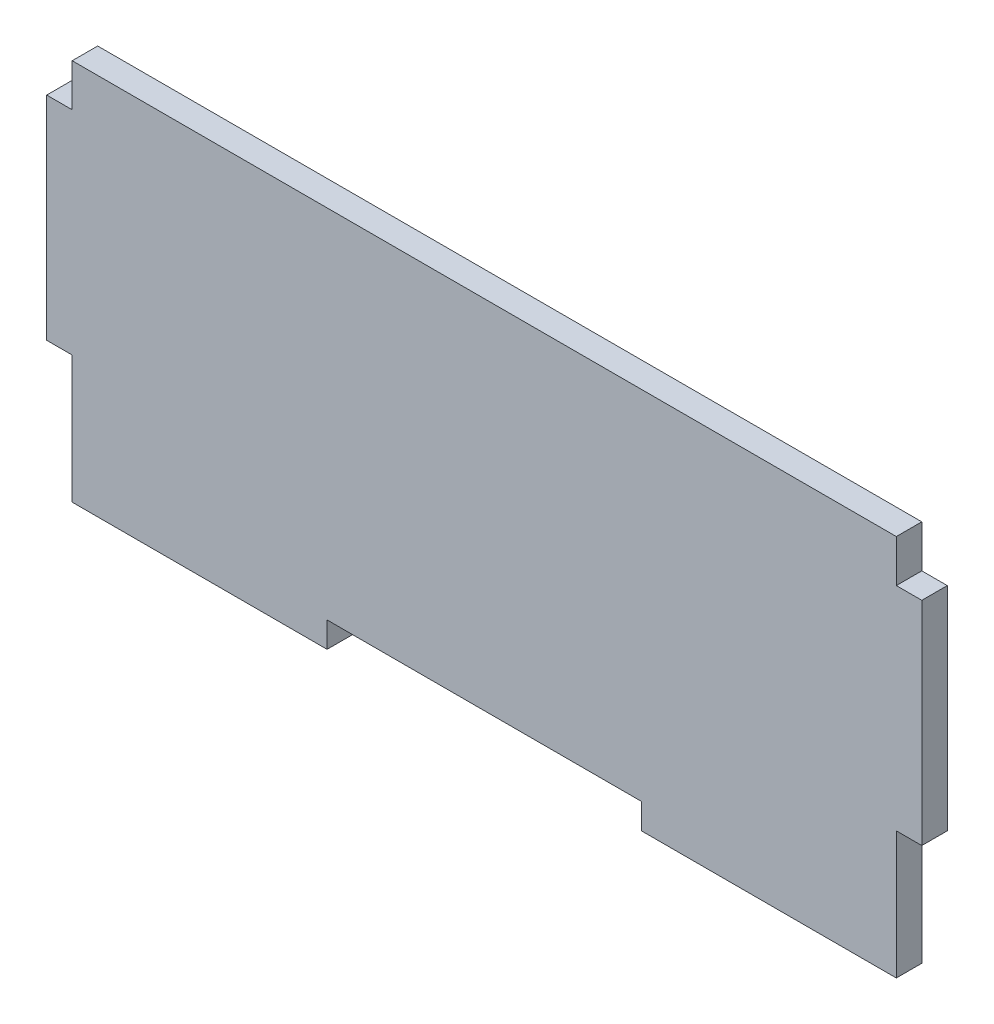
ISO-10303-21;
HEADER;
FILE_DESCRIPTION(('STEP AP214'),'2;1');
FILE_NAME('part.step','',(''),(''),'','','');
FILE_SCHEMA(('AUTOMOTIVE_DESIGN { 1 0 10303 214 1 1 1 1 }'));
ENDSEC;
DATA;
#1=APPLICATION_CONTEXT('core data for automotive mechanical design processes');
#2=APPLICATION_PROTOCOL_DEFINITION('international standard','automotive_design',2000,#1);
#3=PRODUCT_CONTEXT('',#1,'mechanical');
#4=PRODUCT('Part','Part','',(#3));
#5=PRODUCT_RELATED_PRODUCT_CATEGORY('part','',(#4));
#6=PRODUCT_DEFINITION_FORMATION('','',#4);
#7=PRODUCT_DEFINITION_CONTEXT('part definition',#1,'design');
#8=PRODUCT_DEFINITION('design','',#6,#7);
#9=PRODUCT_DEFINITION_SHAPE('','',#8);
#10=(LENGTH_UNIT() NAMED_UNIT(*) SI_UNIT(.MILLI.,.METRE.));
#11=(NAMED_UNIT(*) PLANE_ANGLE_UNIT() SI_UNIT($,.RADIAN.));
#12=(NAMED_UNIT(*) SI_UNIT($,.STERADIAN.) SOLID_ANGLE_UNIT());
#13=UNCERTAINTY_MEASURE_WITH_UNIT(LENGTH_MEASURE(1.E-05),#10,'distance_accuracy_value','');
#14=(GEOMETRIC_REPRESENTATION_CONTEXT(3) GLOBAL_UNCERTAINTY_ASSIGNED_CONTEXT((#13)) GLOBAL_UNIT_ASSIGNED_CONTEXT((#10,
#11,#12)) REPRESENTATION_CONTEXT('',''));
#15=CARTESIAN_POINT('',(0.,0.,0.));
#16=DIRECTION('',(0.,0.,1.));
#17=DIRECTION('',(1.,0.,0.));
#18=AXIS2_PLACEMENT_3D('',#15,#16,#17);
#19=CARTESIAN_POINT('',(-51.5,-27.5,3.));
#20=DIRECTION('',(0.,1.,0.));
#21=DIRECTION('',(0.,0.,1.));
#22=AXIS2_PLACEMENT_3D('',#19,#20,#21);
#23=PLANE('',#22);
#24=DIRECTION('',(0.,0.,-1.));
#25=VECTOR('',#24,1.);
#26=CARTESIAN_POINT('',(-18.5,-27.5,3.));
#27=LINE('',#26,#25);
#28=CARTESIAN_POINT('',(-18.5,-27.5,3.));
#29=VERTEX_POINT('',#28);
#30=CARTESIAN_POINT('',(-18.5,-27.5,0.));
#31=VERTEX_POINT('',#30);
#32=EDGE_CURVE('E276',#29,#31,#27,.T.);
#33=ORIENTED_EDGE('',*,*,#32,.F.);
#34=DIRECTION('',(1.,0.,0.));
#35=VECTOR('',#34,1.);
#36=CARTESIAN_POINT('',(-51.5,-27.5,3.));
#37=LINE('',#36,#35);
#38=CARTESIAN_POINT('',(-48.5,-27.5,3.));
#39=VERTEX_POINT('',#38);
#40=EDGE_CURVE('E46',#39,#29,#37,.T.);
#41=ORIENTED_EDGE('',*,*,#40,.F.);
#42=DIRECTION('',(0.,0.,-1.));
#43=VECTOR('',#42,1.);
#44=CARTESIAN_POINT('',(-48.5,-27.5,3.));
#45=LINE('',#44,#43);
#46=CARTESIAN_POINT('',(-48.5,-27.5,0.));
#47=VERTEX_POINT('',#46);
#48=EDGE_CURVE('E266',#39,#47,#45,.T.);
#49=ORIENTED_EDGE('',*,*,#48,.T.);
#50=DIRECTION('',(1.,0.,0.));
#51=VECTOR('',#50,1.);
#52=CARTESIAN_POINT('',(-51.5,-27.5,0.));
#53=LINE('',#52,#51);
#54=EDGE_CURVE('E188',#47,#31,#53,.T.);
#55=ORIENTED_EDGE('',*,*,#54,.T.);
#56=EDGE_LOOP('',(#33,#41,#49,#55));
#57=FACE_BOUND('',#56,.T.);
#58=ADVANCED_FACE('F38',(#57),#23,.F.);
#59=CARTESIAN_POINT('',(0.,0.,3.));
#60=DIRECTION('',(0.,0.,-1.));
#61=DIRECTION('',(-1.,0.,0.));
#62=AXIS2_PLACEMENT_3D('',#59,#60,#61);
#63=PLANE('',#62);
#64=DIRECTION('',(0.,-1.,0.));
#65=VECTOR('',#64,1.);
#66=CARTESIAN_POINT('',(48.5,0.,3.));
#67=LINE('',#66,#65);
#68=CARTESIAN_POINT('',(48.5,17.5,3.));
#69=VERTEX_POINT('',#68);
#70=CARTESIAN_POINT('',(48.5,12.5,3.));
#71=VERTEX_POINT('',#70);
#72=EDGE_CURVE('E174',#69,#71,#67,.T.);
#73=ORIENTED_EDGE('',*,*,#72,.F.);
#74=DIRECTION('',(-1.,0.,0.));
#75=VECTOR('',#74,1.);
#76=CARTESIAN_POINT('',(0.,17.5,3.));
#77=LINE('',#76,#75);
#78=CARTESIAN_POINT('',(-48.5,17.5,3.));
#79=VERTEX_POINT('',#78);
#80=EDGE_CURVE('E152',#69,#79,#77,.T.);
#81=ORIENTED_EDGE('',*,*,#80,.T.);
#82=DIRECTION('',(0.,-1.,0.));
#83=VECTOR('',#82,1.);
#84=CARTESIAN_POINT('',(-48.5,0.,3.));
#85=LINE('',#84,#83);
#86=CARTESIAN_POINT('',(-48.5,12.5,3.));
#87=VERTEX_POINT('',#86);
#88=EDGE_CURVE('E238',#79,#87,#85,.T.);
#89=ORIENTED_EDGE('',*,*,#88,.T.);
#90=DIRECTION('',(-1.,0.,0.));
#91=VECTOR('',#90,1.);
#92=CARTESIAN_POINT('',(0.,12.5,3.));
#93=LINE('',#92,#91);
#94=CARTESIAN_POINT('',(-51.5,12.5,3.));
#95=VERTEX_POINT('',#94);
#96=EDGE_CURVE('E240',#87,#95,#93,.T.);
#97=ORIENTED_EDGE('',*,*,#96,.T.);
#98=DIRECTION('',(0.,-1.,0.));
#99=VECTOR('',#98,1.);
#100=CARTESIAN_POINT('',(-51.5,-27.5,3.));
#101=LINE('',#100,#99);
#102=CARTESIAN_POINT('',(-51.5,-12.5,3.));
#103=VERTEX_POINT('',#102);
#104=EDGE_CURVE('E187',#95,#103,#101,.T.);
#105=ORIENTED_EDGE('',*,*,#104,.T.);
#106=DIRECTION('',(-1.,0.,0.));
#107=VECTOR('',#106,1.);
#108=CARTESIAN_POINT('',(0.,-12.5,3.));
#109=LINE('',#108,#107);
#110=CARTESIAN_POINT('',(-48.5,-12.5,3.));
#111=VERTEX_POINT('',#110);
#112=EDGE_CURVE('E272',#111,#103,#109,.T.);
#113=ORIENTED_EDGE('',*,*,#112,.F.);
#114=DIRECTION('',(0.,-1.,0.));
#115=VECTOR('',#114,1.);
#116=CARTESIAN_POINT('',(-48.5,0.,3.));
#117=LINE('',#116,#115);
#118=EDGE_CURVE('E267',#111,#39,#117,.T.);
#119=ORIENTED_EDGE('',*,*,#118,.T.);
#120=ORIENTED_EDGE('',*,*,#40,.T.);
#121=DIRECTION('',(0.,-1.,0.));
#122=VECTOR('',#121,1.);
#123=CARTESIAN_POINT('',(-18.5,0.,3.));
#124=LINE('',#123,#122);
#125=CARTESIAN_POINT('',(-18.5,-24.5,3.));
#126=VERTEX_POINT('',#125);
#127=EDGE_CURVE('E289',#126,#29,#124,.T.);
#128=ORIENTED_EDGE('',*,*,#127,.F.);
#129=DIRECTION('',(-1.,0.,0.));
#130=VECTOR('',#129,1.);
#131=CARTESIAN_POINT('',(0.,-24.5,3.));
#132=LINE('',#131,#130);
#133=CARTESIAN_POINT('',(18.5,-24.5,3.));
#134=VERTEX_POINT('',#133);
#135=EDGE_CURVE('E295',#134,#126,#132,.T.);
#136=ORIENTED_EDGE('',*,*,#135,.F.);
#137=DIRECTION('',(0.,-1.,0.));
#138=VECTOR('',#137,1.);
#139=CARTESIAN_POINT('',(18.5,0.,3.));
#140=LINE('',#139,#138);
#141=CARTESIAN_POINT('',(18.5,-27.5,3.));
#142=VERTEX_POINT('',#141);
#143=EDGE_CURVE('E283',#134,#142,#140,.T.);
#144=ORIENTED_EDGE('',*,*,#143,.T.);
#145=CARTESIAN_POINT('',(48.5,-27.5,3.));
#146=VERTEX_POINT('',#145);
#147=EDGE_CURVE('E191',#142,#146,#37,.T.);
#148=ORIENTED_EDGE('',*,*,#147,.T.);
#149=DIRECTION('',(0.,-1.,0.));
#150=VECTOR('',#149,1.);
#151=CARTESIAN_POINT('',(48.5,0.,3.));
#152=LINE('',#151,#150);
#153=CARTESIAN_POINT('',(48.5,-12.5,3.));
#154=VERTEX_POINT('',#153);
#155=EDGE_CURVE('E222',#154,#146,#152,.T.);
#156=ORIENTED_EDGE('',*,*,#155,.F.);
#157=DIRECTION('',(-1.,0.,0.));
#158=VECTOR('',#157,1.);
#159=CARTESIAN_POINT('',(0.,-12.5,3.));
#160=LINE('',#159,#158);
#161=CARTESIAN_POINT('',(51.5,-12.5,3.));
#162=VERTEX_POINT('',#161);
#163=EDGE_CURVE('E228',#162,#154,#160,.T.);
#164=ORIENTED_EDGE('',*,*,#163,.F.);
#165=DIRECTION('',(0.,1.,0.));
#166=VECTOR('',#165,1.);
#167=CARTESIAN_POINT('',(51.5,-27.5,3.));
#168=LINE('',#167,#166);
#169=CARTESIAN_POINT('',(51.5,12.5,3.));
#170=VERTEX_POINT('',#169);
#171=EDGE_CURVE('E184',#162,#170,#168,.T.);
#172=ORIENTED_EDGE('',*,*,#171,.T.);
#173=DIRECTION('',(-1.,0.,0.));
#174=VECTOR('',#173,1.);
#175=CARTESIAN_POINT('',(0.,12.5,3.));
#176=LINE('',#175,#174);
#177=EDGE_CURVE('E170',#170,#71,#176,.T.);
#178=ORIENTED_EDGE('',*,*,#177,.T.);
#179=EDGE_LOOP('',(#73,#81,#89,#97,#105,#113,#119,#120,#128,#136,#144,#148,#156,#164,#172,#178));
#180=FACE_BOUND('',#179,.T.);
#181=ADVANCED_FACE('F255',(#180),#63,.F.);
#182=CARTESIAN_POINT('',(0.,0.,0.));
#183=DIRECTION('',(0.,0.,-1.));
#184=DIRECTION('',(-1.,0.,0.));
#185=AXIS2_PLACEMENT_3D('',#182,#183,#184);
#186=PLANE('',#185);
#187=DIRECTION('',(-1.,0.,0.));
#188=VECTOR('',#187,1.);
#189=CARTESIAN_POINT('',(48.5,17.5,0.));
#190=LINE('',#189,#188);
#191=CARTESIAN_POINT('',(48.5,17.5,0.));
#192=VERTEX_POINT('',#191);
#193=CARTESIAN_POINT('',(-48.5,17.5,0.));
#194=VERTEX_POINT('',#193);
#195=EDGE_CURVE('E53',#192,#194,#190,.T.);
#196=ORIENTED_EDGE('',*,*,#195,.F.);
#197=DIRECTION('',(0.,-1.,0.));
#198=VECTOR('',#197,1.);
#199=CARTESIAN_POINT('',(48.5,0.,0.));
#200=LINE('',#199,#198);
#201=CARTESIAN_POINT('',(48.5,12.5,0.));
#202=VERTEX_POINT('',#201);
#203=EDGE_CURVE('E161',#192,#202,#200,.T.);
#204=ORIENTED_EDGE('',*,*,#203,.T.);
#205=DIRECTION('',(-1.,0.,0.));
#206=VECTOR('',#205,1.);
#207=CARTESIAN_POINT('',(0.,12.5,0.));
#208=LINE('',#207,#206);
#209=CARTESIAN_POINT('',(51.5,12.5,0.));
#210=VERTEX_POINT('',#209);
#211=EDGE_CURVE('E171',#210,#202,#208,.T.);
#212=ORIENTED_EDGE('',*,*,#211,.F.);
#213=DIRECTION('',(0.,1.,0.));
#214=VECTOR('',#213,1.);
#215=CARTESIAN_POINT('',(51.5,-27.5,0.));
#216=LINE('',#215,#214);
#217=CARTESIAN_POINT('',(51.5,-12.5,0.));
#218=VERTEX_POINT('',#217);
#219=EDGE_CURVE('E181',#218,#210,#216,.T.);
#220=ORIENTED_EDGE('',*,*,#219,.F.);
#221=DIRECTION('',(-1.,0.,0.));
#222=VECTOR('',#221,1.);
#223=CARTESIAN_POINT('',(0.,-12.5,0.));
#224=LINE('',#223,#222);
#225=CARTESIAN_POINT('',(48.5,-12.5,0.));
#226=VERTEX_POINT('',#225);
#227=EDGE_CURVE('E227',#218,#226,#224,.T.);
#228=ORIENTED_EDGE('',*,*,#227,.T.);
#229=DIRECTION('',(0.,-1.,0.));
#230=VECTOR('',#229,1.);
#231=CARTESIAN_POINT('',(48.5,0.,0.));
#232=LINE('',#231,#230);
#233=CARTESIAN_POINT('',(48.5,-27.5,0.));
#234=VERTEX_POINT('',#233);
#235=EDGE_CURVE('E219',#226,#234,#232,.T.);
#236=ORIENTED_EDGE('',*,*,#235,.T.);
#237=CARTESIAN_POINT('',(18.5,-27.5,0.));
#238=VERTEX_POINT('',#237);
#239=EDGE_CURVE('E198',#238,#234,#53,.T.);
#240=ORIENTED_EDGE('',*,*,#239,.F.);
#241=DIRECTION('',(0.,-1.,0.));
#242=VECTOR('',#241,1.);
#243=CARTESIAN_POINT('',(18.5,0.,0.));
#244=LINE('',#243,#242);
#245=CARTESIAN_POINT('',(18.5,-24.5,0.));
#246=VERTEX_POINT('',#245);
#247=EDGE_CURVE('E287',#246,#238,#244,.T.);
#248=ORIENTED_EDGE('',*,*,#247,.F.);
#249=DIRECTION('',(-1.,0.,0.));
#250=VECTOR('',#249,1.);
#251=CARTESIAN_POINT('',(0.,-24.5,0.));
#252=LINE('',#251,#250);
#253=CARTESIAN_POINT('',(-18.5,-24.5,0.));
#254=VERTEX_POINT('',#253);
#255=EDGE_CURVE('E290',#246,#254,#252,.T.);
#256=ORIENTED_EDGE('',*,*,#255,.T.);
#257=DIRECTION('',(0.,-1.,0.));
#258=VECTOR('',#257,1.);
#259=CARTESIAN_POINT('',(-18.5,0.,0.));
#260=LINE('',#259,#258);
#261=EDGE_CURVE('E60',#254,#31,#260,.T.);
#262=ORIENTED_EDGE('',*,*,#261,.T.);
#263=ORIENTED_EDGE('',*,*,#54,.F.);
#264=DIRECTION('',(0.,-1.,0.));
#265=VECTOR('',#264,1.);
#266=CARTESIAN_POINT('',(-48.5,0.,0.));
#267=LINE('',#266,#265);
#268=CARTESIAN_POINT('',(-48.5,-12.5,0.));
#269=VERTEX_POINT('',#268);
#270=EDGE_CURVE('E270',#269,#47,#267,.T.);
#271=ORIENTED_EDGE('',*,*,#270,.F.);
#272=DIRECTION('',(-1.,0.,0.));
#273=VECTOR('',#272,1.);
#274=CARTESIAN_POINT('',(0.,-12.5,0.));
#275=LINE('',#274,#273);
#276=CARTESIAN_POINT('',(-51.5,-12.5,0.));
#277=VERTEX_POINT('',#276);
#278=EDGE_CURVE('E273',#269,#277,#275,.T.);
#279=ORIENTED_EDGE('',*,*,#278,.T.);
#280=DIRECTION('',(0.,-1.,0.));
#281=VECTOR('',#280,1.);
#282=CARTESIAN_POINT('',(-51.5,-27.5,0.));
#283=LINE('',#282,#281);
#284=CARTESIAN_POINT('',(-51.5,12.5,0.));
#285=VERTEX_POINT('',#284);
#286=EDGE_CURVE('E196',#285,#277,#283,.T.);
#287=ORIENTED_EDGE('',*,*,#286,.F.);
#288=DIRECTION('',(-1.,0.,0.));
#289=VECTOR('',#288,1.);
#290=CARTESIAN_POINT('',(0.,12.5,0.));
#291=LINE('',#290,#289);
#292=CARTESIAN_POINT('',(-48.5,12.5,0.));
#293=VERTEX_POINT('',#292);
#294=EDGE_CURVE('E241',#293,#285,#291,.T.);
#295=ORIENTED_EDGE('',*,*,#294,.F.);
#296=DIRECTION('',(0.,-1.,0.));
#297=VECTOR('',#296,1.);
#298=CARTESIAN_POINT('',(-48.5,0.,0.));
#299=LINE('',#298,#297);
#300=EDGE_CURVE('E164',#194,#293,#299,.T.);
#301=ORIENTED_EDGE('',*,*,#300,.F.);
#302=EDGE_LOOP('',(#196,#204,#212,#220,#228,#236,#240,#248,#256,#262,#263,#271,#279,#287,#295,#301));
#303=FACE_BOUND('',#302,.T.);
#304=ADVANCED_FACE('F159',(#303),#186,.T.);
#305=CARTESIAN_POINT('',(51.5,-27.5,3.));
#306=DIRECTION('',(-1.,0.,0.));
#307=DIRECTION('',(0.,0.,1.));
#308=AXIS2_PLACEMENT_3D('',#305,#306,#307);
#309=PLANE('',#308);
#310=DIRECTION('',(0.,0.,-1.));
#311=VECTOR('',#310,1.);
#312=CARTESIAN_POINT('',(51.5,-12.5,3.));
#313=LINE('',#312,#311);
#314=EDGE_CURVE('E223',#162,#218,#313,.T.);
#315=ORIENTED_EDGE('',*,*,#314,.T.);
#316=ORIENTED_EDGE('',*,*,#219,.T.);
#317=DIRECTION('',(0.,0.,-1.));
#318=VECTOR('',#317,1.);
#319=CARTESIAN_POINT('',(51.5,12.5,3.));
#320=LINE('',#319,#318);
#321=EDGE_CURVE('E182',#170,#210,#320,.T.);
#322=ORIENTED_EDGE('',*,*,#321,.F.);
#323=ORIENTED_EDGE('',*,*,#171,.F.);
#324=EDGE_LOOP('',(#315,#316,#322,#323));
#325=FACE_BOUND('',#324,.T.);
#326=ADVANCED_FACE('F40',(#325),#309,.F.);
#327=CARTESIAN_POINT('',(-51.5,-27.5,3.));
#328=DIRECTION('',(1.,0.,0.));
#329=DIRECTION('',(0.,0.,-1.));
#330=AXIS2_PLACEMENT_3D('',#327,#328,#329);
#331=PLANE('',#330);
#332=ORIENTED_EDGE('',*,*,#104,.F.);
#333=DIRECTION('',(0.,0.,-1.));
#334=VECTOR('',#333,1.);
#335=CARTESIAN_POINT('',(-51.5,12.5,3.));
#336=LINE('',#335,#334);
#337=EDGE_CURVE('E231',#95,#285,#336,.T.);
#338=ORIENTED_EDGE('',*,*,#337,.T.);
#339=ORIENTED_EDGE('',*,*,#286,.T.);
#340=DIRECTION('',(0.,0.,-1.));
#341=VECTOR('',#340,1.);
#342=CARTESIAN_POINT('',(-51.5,-12.5,3.));
#343=LINE('',#342,#341);
#344=EDGE_CURVE('E246',#103,#277,#343,.T.);
#345=ORIENTED_EDGE('',*,*,#344,.F.);
#346=EDGE_LOOP('',(#332,#338,#339,#345));
#347=FACE_BOUND('',#346,.T.);
#348=ADVANCED_FACE('F309',(#347),#331,.F.);
#349=ORIENTED_EDGE('',*,*,#147,.F.);
#350=DIRECTION('',(0.,0.,-1.));
#351=VECTOR('',#350,1.);
#352=CARTESIAN_POINT('',(18.5,-27.5,3.));
#353=LINE('',#352,#351);
#354=EDGE_CURVE('E212',#142,#238,#353,.T.);
#355=ORIENTED_EDGE('',*,*,#354,.T.);
#356=ORIENTED_EDGE('',*,*,#239,.T.);
#357=DIRECTION('',(0.,0.,-1.));
#358=VECTOR('',#357,1.);
#359=CARTESIAN_POINT('',(48.5,-27.5,3.));
#360=LINE('',#359,#358);
#361=EDGE_CURVE('E211',#146,#234,#360,.T.);
#362=ORIENTED_EDGE('',*,*,#361,.F.);
#363=EDGE_LOOP('',(#349,#355,#356,#362));
#364=FACE_BOUND('',#363,.T.);
#365=ADVANCED_FACE('F210',(#364),#23,.F.);
#366=CARTESIAN_POINT('',(48.5,0.,3.));
#367=DIRECTION('',(1.,0.,0.));
#368=DIRECTION('',(0.,0.,-1.));
#369=AXIS2_PLACEMENT_3D('',#366,#367,#368);
#370=PLANE('',#369);
#371=DIRECTION('',(0.,0.,-1.));
#372=VECTOR('',#371,1.);
#373=CARTESIAN_POINT('',(48.5,17.5,10.));
#374=LINE('',#373,#372);
#375=EDGE_CURVE('E149',#69,#192,#374,.T.);
#376=ORIENTED_EDGE('',*,*,#375,.F.);
#377=ORIENTED_EDGE('',*,*,#72,.T.);
#378=DIRECTION('',(0.,0.,-1.));
#379=VECTOR('',#378,1.);
#380=CARTESIAN_POINT('',(48.5,12.5,3.));
#381=LINE('',#380,#379);
#382=EDGE_CURVE('E168',#71,#202,#381,.T.);
#383=ORIENTED_EDGE('',*,*,#382,.T.);
#384=ORIENTED_EDGE('',*,*,#203,.F.);
#385=EDGE_LOOP('',(#376,#377,#383,#384));
#386=FACE_BOUND('',#385,.T.);
#387=ADVANCED_FACE('F166',(#386),#370,.T.);
#388=CARTESIAN_POINT('',(0.,12.5,3.));
#389=DIRECTION('',(0.,-1.,0.));
#390=DIRECTION('',(0.,0.,-1.));
#391=AXIS2_PLACEMENT_3D('',#388,#389,#390);
#392=PLANE('',#391);
#393=ORIENTED_EDGE('',*,*,#211,.T.);
#394=ORIENTED_EDGE('',*,*,#382,.F.);
#395=ORIENTED_EDGE('',*,*,#177,.F.);
#396=ORIENTED_EDGE('',*,*,#321,.T.);
#397=EDGE_LOOP('',(#393,#394,#395,#396));
#398=FACE_BOUND('',#397,.T.);
#399=ADVANCED_FACE('F253',(#398),#392,.F.);
#400=CARTESIAN_POINT('',(0.,-12.5,3.));
#401=DIRECTION('',(0.,-1.,0.));
#402=DIRECTION('',(0.,0.,-1.));
#403=AXIS2_PLACEMENT_3D('',#400,#401,#402);
#404=PLANE('',#403);
#405=ORIENTED_EDGE('',*,*,#278,.F.);
#406=DIRECTION('',(0.,0.,-1.));
#407=VECTOR('',#406,1.);
#408=CARTESIAN_POINT('',(-48.5,-12.5,3.));
#409=LINE('',#408,#407);
#410=EDGE_CURVE('E263',#111,#269,#409,.T.);
#411=ORIENTED_EDGE('',*,*,#410,.F.);
#412=ORIENTED_EDGE('',*,*,#112,.T.);
#413=ORIENTED_EDGE('',*,*,#344,.T.);
#414=EDGE_LOOP('',(#405,#411,#412,#413));
#415=FACE_BOUND('',#414,.T.);
#416=ADVANCED_FACE('F312',(#415),#404,.T.);
#417=CARTESIAN_POINT('',(-48.5,0.,3.));
#418=DIRECTION('',(1.,0.,0.));
#419=DIRECTION('',(0.,1.,0.));
#420=AXIS2_PLACEMENT_3D('',#417,#418,#419);
#421=PLANE('',#420);
#422=ORIENTED_EDGE('',*,*,#270,.T.);
#423=ORIENTED_EDGE('',*,*,#48,.F.);
#424=ORIENTED_EDGE('',*,*,#118,.F.);
#425=ORIENTED_EDGE('',*,*,#410,.T.);
#426=EDGE_LOOP('',(#422,#423,#424,#425));
#427=FACE_BOUND('',#426,.T.);
#428=ADVANCED_FACE('F315',(#427),#421,.F.);
#429=CARTESIAN_POINT('',(-48.5,0.,3.));
#430=DIRECTION('',(1.,0.,0.));
#431=DIRECTION('',(0.,1.,0.));
#432=AXIS2_PLACEMENT_3D('',#429,#430,#431);
#433=PLANE('',#432);
#434=ORIENTED_EDGE('',*,*,#88,.F.);
#435=DIRECTION('',(0.,0.,-1.));
#436=VECTOR('',#435,1.);
#437=CARTESIAN_POINT('',(-48.5,17.5,3.));
#438=LINE('',#437,#436);
#439=EDGE_CURVE('E11',#79,#194,#438,.T.);
#440=ORIENTED_EDGE('',*,*,#439,.T.);
#441=ORIENTED_EDGE('',*,*,#300,.T.);
#442=DIRECTION('',(0.,0.,-1.));
#443=VECTOR('',#442,1.);
#444=CARTESIAN_POINT('',(-48.5,12.5,3.));
#445=LINE('',#444,#443);
#446=EDGE_CURVE('E244',#87,#293,#445,.T.);
#447=ORIENTED_EDGE('',*,*,#446,.F.);
#448=EDGE_LOOP('',(#434,#440,#441,#447));
#449=FACE_BOUND('',#448,.T.);
#450=ADVANCED_FACE('F301',(#449),#433,.F.);
#451=CARTESIAN_POINT('',(0.,12.5,3.));
#452=DIRECTION('',(0.,-1.,0.));
#453=DIRECTION('',(0.,0.,-1.));
#454=AXIS2_PLACEMENT_3D('',#451,#452,#453);
#455=PLANE('',#454);
#456=ORIENTED_EDGE('',*,*,#294,.T.);
#457=ORIENTED_EDGE('',*,*,#337,.F.);
#458=ORIENTED_EDGE('',*,*,#96,.F.);
#459=ORIENTED_EDGE('',*,*,#446,.T.);
#460=EDGE_LOOP('',(#456,#457,#458,#459));
#461=FACE_BOUND('',#460,.T.);
#462=ADVANCED_FACE('F304',(#461),#455,.F.);
#463=CARTESIAN_POINT('',(0.,-12.5,3.));
#464=DIRECTION('',(0.,-1.,0.));
#465=DIRECTION('',(0.,0.,-1.));
#466=AXIS2_PLACEMENT_3D('',#463,#464,#465);
#467=PLANE('',#466);
#468=ORIENTED_EDGE('',*,*,#227,.F.);
#469=ORIENTED_EDGE('',*,*,#314,.F.);
#470=ORIENTED_EDGE('',*,*,#163,.T.);
#471=DIRECTION('',(0.,0.,-1.));
#472=VECTOR('',#471,1.);
#473=CARTESIAN_POINT('',(48.5,-12.5,3.));
#474=LINE('',#473,#472);
#475=EDGE_CURVE('E176',#154,#226,#474,.T.);
#476=ORIENTED_EDGE('',*,*,#475,.T.);
#477=EDGE_LOOP('',(#468,#469,#470,#476));
#478=FACE_BOUND('',#477,.T.);
#479=ADVANCED_FACE('F260',(#478),#467,.T.);
#480=CARTESIAN_POINT('',(48.5,0.,3.));
#481=DIRECTION('',(1.,0.,0.));
#482=DIRECTION('',(0.,0.,-1.));
#483=AXIS2_PLACEMENT_3D('',#480,#481,#482);
#484=PLANE('',#483);
#485=ORIENTED_EDGE('',*,*,#235,.F.);
#486=ORIENTED_EDGE('',*,*,#475,.F.);
#487=ORIENTED_EDGE('',*,*,#155,.T.);
#488=ORIENTED_EDGE('',*,*,#361,.T.);
#489=EDGE_LOOP('',(#485,#486,#487,#488));
#490=FACE_BOUND('',#489,.T.);
#491=ADVANCED_FACE('F217',(#490),#484,.T.);
#492=CARTESIAN_POINT('',(-18.5,0.,3.));
#493=DIRECTION('',(1.,0.,0.));
#494=DIRECTION('',(0.,0.,-1.));
#495=AXIS2_PLACEMENT_3D('',#492,#493,#494);
#496=PLANE('',#495);
#497=ORIENTED_EDGE('',*,*,#261,.F.);
#498=DIRECTION('',(0.,0.,-1.));
#499=VECTOR('',#498,1.);
#500=CARTESIAN_POINT('',(-18.5,-24.5,3.));
#501=LINE('',#500,#499);
#502=EDGE_CURVE('E280',#126,#254,#501,.T.);
#503=ORIENTED_EDGE('',*,*,#502,.F.);
#504=ORIENTED_EDGE('',*,*,#127,.T.);
#505=ORIENTED_EDGE('',*,*,#32,.T.);
#506=EDGE_LOOP('',(#497,#503,#504,#505));
#507=FACE_BOUND('',#506,.T.);
#508=ADVANCED_FACE('F320',(#507),#496,.T.);
#509=CARTESIAN_POINT('',(18.5,0.,3.));
#510=DIRECTION('',(1.,0.,0.));
#511=DIRECTION('',(0.,0.,-1.));
#512=AXIS2_PLACEMENT_3D('',#509,#510,#511);
#513=PLANE('',#512);
#514=ORIENTED_EDGE('',*,*,#247,.T.);
#515=ORIENTED_EDGE('',*,*,#354,.F.);
#516=ORIENTED_EDGE('',*,*,#143,.F.);
#517=DIRECTION('',(0.,0.,-1.));
#518=VECTOR('',#517,1.);
#519=CARTESIAN_POINT('',(18.5,-24.5,3.));
#520=LINE('',#519,#518);
#521=EDGE_CURVE('E282',#134,#246,#520,.T.);
#522=ORIENTED_EDGE('',*,*,#521,.T.);
#523=EDGE_LOOP('',(#514,#515,#516,#522));
#524=FACE_BOUND('',#523,.T.);
#525=ADVANCED_FACE('F325',(#524),#513,.F.);
#526=CARTESIAN_POINT('',(0.,-24.5,3.));
#527=DIRECTION('',(0.,-1.,0.));
#528=DIRECTION('',(0.,0.,-1.));
#529=AXIS2_PLACEMENT_3D('',#526,#527,#528);
#530=PLANE('',#529);
#531=ORIENTED_EDGE('',*,*,#255,.F.);
#532=ORIENTED_EDGE('',*,*,#521,.F.);
#533=ORIENTED_EDGE('',*,*,#135,.T.);
#534=ORIENTED_EDGE('',*,*,#502,.T.);
#535=EDGE_LOOP('',(#531,#532,#533,#534));
#536=FACE_BOUND('',#535,.T.);
#537=ADVANCED_FACE('F323',(#536),#530,.T.);
#538=CARTESIAN_POINT('',(48.5,17.5,10.));
#539=DIRECTION('',(0.,-1.,0.));
#540=DIRECTION('',(0.,0.,-1.));
#541=AXIS2_PLACEMENT_3D('',#538,#539,#540);
#542=PLANE('',#541);
#543=ORIENTED_EDGE('',*,*,#375,.T.);
#544=ORIENTED_EDGE('',*,*,#195,.T.);
#545=ORIENTED_EDGE('',*,*,#439,.F.);
#546=ORIENTED_EDGE('',*,*,#80,.F.);
#547=EDGE_LOOP('',(#543,#544,#545,#546));
#548=FACE_BOUND('',#547,.T.);
#549=ADVANCED_FACE('F150',(#548),#542,.F.);
#550=CLOSED_SHELL('',(#58,#181,#304,#326,#348,#365,#387,#399,#416,#428,#450,#462,#479,#491,#508,
#525,#537,#549));
#551=MANIFOLD_SOLID_BREP('B2',#550);
#552=ADVANCED_BREP_SHAPE_REPRESENTATION('',(#18,#551),#14);
#553=SHAPE_DEFINITION_REPRESENTATION(#9,#552);
ENDSEC;
END-ISO-10303-21;
